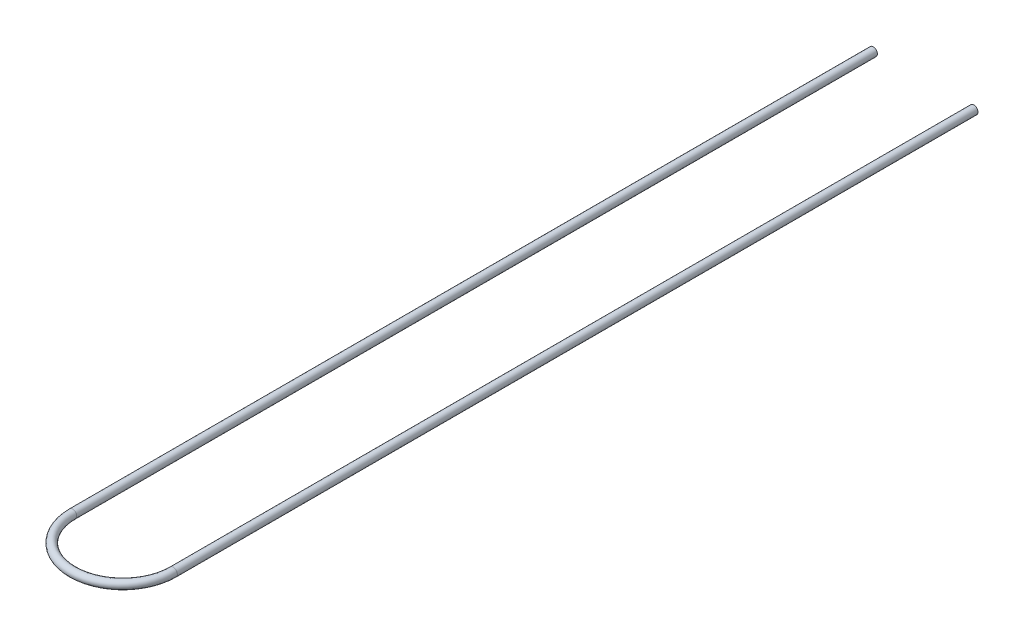
ISO-10303-21;
HEADER;
FILE_DESCRIPTION(('STEP AP214'),'2;1');
FILE_NAME('part.step','',(''),(''),'','','');
FILE_SCHEMA(('AUTOMOTIVE_DESIGN { 1 0 10303 214 1 1 1 1 }'));
ENDSEC;
DATA;
#1=APPLICATION_CONTEXT('core data for automotive mechanical design processes');
#2=APPLICATION_PROTOCOL_DEFINITION('international standard','automotive_design',2000,#1);
#3=PRODUCT_CONTEXT('',#1,'mechanical');
#4=PRODUCT('Part','Part','',(#3));
#5=PRODUCT_RELATED_PRODUCT_CATEGORY('part','',(#4));
#6=PRODUCT_DEFINITION_FORMATION('','',#4);
#7=PRODUCT_DEFINITION_CONTEXT('part definition',#1,'design');
#8=PRODUCT_DEFINITION('design','',#6,#7);
#9=PRODUCT_DEFINITION_SHAPE('','',#8);
#10=(LENGTH_UNIT() NAMED_UNIT(*) SI_UNIT(.MILLI.,.METRE.));
#11=(NAMED_UNIT(*) PLANE_ANGLE_UNIT() SI_UNIT($,.RADIAN.));
#12=(NAMED_UNIT(*) SI_UNIT($,.STERADIAN.) SOLID_ANGLE_UNIT());
#13=UNCERTAINTY_MEASURE_WITH_UNIT(LENGTH_MEASURE(1.E-05),#10,'distance_accuracy_value','');
#14=(GEOMETRIC_REPRESENTATION_CONTEXT(3) GLOBAL_UNCERTAINTY_ASSIGNED_CONTEXT((#13)) GLOBAL_UNIT_ASSIGNED_CONTEXT((#10,
#11,#12)) REPRESENTATION_CONTEXT('',''));
#15=CARTESIAN_POINT('',(0.,0.,0.));
#16=DIRECTION('',(0.,0.,1.));
#17=DIRECTION('',(1.,0.,0.));
#18=AXIS2_PLACEMENT_3D('',#15,#16,#17);
#19=CARTESIAN_POINT('',(-40.,0.,299.999999999999));
#20=DIRECTION('',(0.,0.,1.));
#21=DIRECTION('',(1.,0.,0.));
#22=AXIS2_PLACEMENT_3D('',#19,#20,#21);
#23=CYLINDRICAL_SURFACE('',#22,11.1);
#24=CARTESIAN_POINT('',(-39.9999999999997,0.,2440.));
#25=DIRECTION('',(0.,0.,1.));
#26=DIRECTION('',(1.,0.,0.));
#27=AXIS2_PLACEMENT_3D('',#24,#25,#26);
#28=CIRCLE('',#27,11.1);
#29=CARTESIAN_POINT('',(-51.0999999999997,0.,2440.));
#30=VERTEX_POINT('',#29);
#31=EDGE_CURVE('E52',#30,#30,#28,.T.);
#32=ORIENTED_EDGE('',*,*,#31,.F.);
#33=EDGE_LOOP('',(#32));
#34=FACE_BOUND('',#33,.T.);
#35=CARTESIAN_POINT('',(-40.,0.,299.999999999999));
#36=DIRECTION('',(0.,0.,1.));
#37=DIRECTION('',(1.,0.,0.));
#38=AXIS2_PLACEMENT_3D('',#35,#36,#37);
#39=CIRCLE('',#38,11.1);
#40=CARTESIAN_POINT('',(-28.9,0.,299.999999999999));
#41=VERTEX_POINT('',#40);
#42=EDGE_CURVE('E50',#41,#41,#39,.T.);
#43=ORIENTED_EDGE('',*,*,#42,.T.);
#44=EDGE_LOOP('',(#43));
#45=FACE_BOUND('',#44,.T.);
#46=ADVANCED_FACE('F29',(#34,#45),#23,.T.);
#47=CARTESIAN_POINT('',(94.4650000000003,0.,2440.));
#48=DIRECTION('',(0.,1.,0.));
#49=DIRECTION('',(0.,0.,1.));
#50=AXIS2_PLACEMENT_3D('',#47,#48,#49);
#51=TOROIDAL_SURFACE('',#50,134.465,11.1);
#52=CARTESIAN_POINT('',(228.93,0.,2440.));
#53=DIRECTION('',(0.,0.,-1.));
#54=DIRECTION('',(-1.,0.,0.));
#55=AXIS2_PLACEMENT_3D('',#52,#53,#54);
#56=CIRCLE('',#55,11.1);
#57=CARTESIAN_POINT('',(240.03,0.,2440.));
#58=VERTEX_POINT('',#57);
#59=EDGE_CURVE('E33',#58,#58,#56,.T.);
#60=CARTESIAN_POINT('',(94.4650000000003,0.,2440.));
#61=DIRECTION('',(0.,1.,0.));
#62=DIRECTION('',(0.,0.,1.));
#63=AXIS2_PLACEMENT_3D('',#60,#61,#62);
#64=CIRCLE('',#63,145.565);
#65=EDGE_CURVE('',#30,#58,#64,.T.);
#66=ORIENTED_EDGE('',*,*,#31,.T.);
#67=ORIENTED_EDGE('',*,*,#59,.F.);
#68=ORIENTED_EDGE('',*,*,#65,.T.);
#69=ORIENTED_EDGE('',*,*,#65,.F.);
#70=EDGE_LOOP('',(#66,#68,#67,#69));
#71=FACE_BOUND('',#70,.T.);
#72=ADVANCED_FACE('F60',(#71),#51,.T.);
#73=CARTESIAN_POINT('',(228.93,0.,2440.));
#74=DIRECTION('',(0.,0.,-1.));
#75=DIRECTION('',(-1.,0.,0.));
#76=AXIS2_PLACEMENT_3D('',#73,#74,#75);
#77=CYLINDRICAL_SURFACE('',#76,11.1);
#78=CARTESIAN_POINT('',(228.93,0.,299.999999999999));
#79=DIRECTION('',(0.,0.,-1.));
#80=DIRECTION('',(-1.,0.,0.));
#81=AXIS2_PLACEMENT_3D('',#78,#79,#80);
#82=CIRCLE('',#81,11.1);
#83=CARTESIAN_POINT('',(217.83,0.,299.999999999999));
#84=VERTEX_POINT('',#83);
#85=EDGE_CURVE('E46',#84,#84,#82,.T.);
#86=ORIENTED_EDGE('',*,*,#85,.F.);
#87=EDGE_LOOP('',(#86));
#88=FACE_BOUND('',#87,.T.);
#89=ORIENTED_EDGE('',*,*,#59,.T.);
#90=EDGE_LOOP('',(#89));
#91=FACE_BOUND('',#90,.T.);
#92=ADVANCED_FACE('F31',(#88,#91),#77,.T.);
#93=CARTESIAN_POINT('',(-40.,0.,299.999999999999));
#94=DIRECTION('',(0.,0.,1.));
#95=DIRECTION('',(1.,0.,0.));
#96=AXIS2_PLACEMENT_3D('',#93,#94,#95);
#97=PLANE('',#96);
#98=CARTESIAN_POINT('',(-40.,0.,299.999999999999));
#99=DIRECTION('',(0.,0.,1.));
#100=DIRECTION('',(1.,0.,0.));
#101=AXIS2_PLACEMENT_3D('',#98,#99,#100);
#102=CIRCLE('',#101,9.94999999999998);
#103=CARTESIAN_POINT('',(-30.05,0.,299.999999999999));
#104=VERTEX_POINT('',#103);
#105=EDGE_CURVE('E49',#104,#104,#102,.F.);
#106=ORIENTED_EDGE('',*,*,#105,.F.);
#107=EDGE_LOOP('',(#106));
#108=FACE_BOUND('',#107,.T.);
#109=ORIENTED_EDGE('',*,*,#42,.F.);
#110=EDGE_LOOP('',(#109));
#111=FACE_BOUND('',#110,.T.);
#112=ADVANCED_FACE('F66',(#108,#111),#97,.F.);
#113=CARTESIAN_POINT('',(228.93,0.,299.999999999999));
#114=DIRECTION('',(0.,0.,-1.));
#115=DIRECTION('',(-1.,0.,0.));
#116=AXIS2_PLACEMENT_3D('',#113,#114,#115);
#117=PLANE('',#116);
#118=CARTESIAN_POINT('',(228.93,0.,299.999999999999));
#119=DIRECTION('',(0.,0.,-1.));
#120=DIRECTION('',(-1.,0.,0.));
#121=AXIS2_PLACEMENT_3D('',#118,#119,#120);
#122=CIRCLE('',#121,9.94999999999998);
#123=CARTESIAN_POINT('',(218.98,0.,299.999999999999));
#124=VERTEX_POINT('',#123);
#125=EDGE_CURVE('E10',#124,#124,#122,.F.);
#126=ORIENTED_EDGE('',*,*,#125,.T.);
#127=EDGE_LOOP('',(#126));
#128=FACE_BOUND('',#127,.T.);
#129=ORIENTED_EDGE('',*,*,#85,.T.);
#130=EDGE_LOOP('',(#129));
#131=FACE_BOUND('',#130,.T.);
#132=ADVANCED_FACE('F84',(#128,#131),#117,.T.);
#133=CARTESIAN_POINT('',(-40.,0.,299.999999999999));
#134=DIRECTION('',(0.,0.,1.));
#135=DIRECTION('',(1.,0.,0.));
#136=AXIS2_PLACEMENT_3D('',#133,#134,#135);
#137=CYLINDRICAL_SURFACE('',#136,9.94999999999998);
#138=CARTESIAN_POINT('',(-39.9999999999997,0.,2440.));
#139=DIRECTION('',(0.,0.,1.));
#140=DIRECTION('',(1.,0.,0.));
#141=AXIS2_PLACEMENT_3D('',#138,#139,#140);
#142=CIRCLE('',#141,9.94999999999998);
#143=CARTESIAN_POINT('',(-49.9499999999997,0.,2440.));
#144=VERTEX_POINT('',#143);
#145=EDGE_CURVE('E42',#144,#144,#142,.F.);
#146=ORIENTED_EDGE('',*,*,#145,.F.);
#147=EDGE_LOOP('',(#146));
#148=FACE_BOUND('',#147,.T.);
#149=ORIENTED_EDGE('',*,*,#105,.T.);
#150=EDGE_LOOP('',(#149));
#151=FACE_BOUND('',#150,.T.);
#152=ADVANCED_FACE('F78',(#148,#151),#137,.F.);
#153=CARTESIAN_POINT('',(94.4650000000003,0.,2440.));
#154=DIRECTION('',(0.,1.,0.));
#155=DIRECTION('',(0.,0.,1.));
#156=AXIS2_PLACEMENT_3D('',#153,#154,#155);
#157=TOROIDAL_SURFACE('',#156,134.465,9.94999999999998);
#158=CARTESIAN_POINT('',(228.93,0.,2440.));
#159=DIRECTION('',(0.,0.,-1.));
#160=DIRECTION('',(-1.,0.,0.));
#161=AXIS2_PLACEMENT_3D('',#158,#159,#160);
#162=CIRCLE('',#161,9.94999999999998);
#163=CARTESIAN_POINT('',(238.88,0.,2440.));
#164=VERTEX_POINT('',#163);
#165=EDGE_CURVE('E37',#164,#164,#162,.F.);
#166=CARTESIAN_POINT('',(94.4650000000003,0.,2440.));
#167=DIRECTION('',(0.,1.,0.));
#168=DIRECTION('',(0.,0.,1.));
#169=AXIS2_PLACEMENT_3D('',#166,#167,#168);
#170=CIRCLE('',#169,144.415);
#171=EDGE_CURVE('',#144,#164,#170,.T.);
#172=ORIENTED_EDGE('',*,*,#145,.T.);
#173=ORIENTED_EDGE('',*,*,#165,.F.);
#174=ORIENTED_EDGE('',*,*,#171,.T.);
#175=ORIENTED_EDGE('',*,*,#171,.F.);
#176=EDGE_LOOP('',(#172,#174,#173,#175));
#177=FACE_BOUND('',#176,.T.);
#178=ADVANCED_FACE('F72',(#177),#157,.F.);
#179=CARTESIAN_POINT('',(228.93,0.,2440.));
#180=DIRECTION('',(0.,0.,-1.));
#181=DIRECTION('',(-1.,0.,0.));
#182=AXIS2_PLACEMENT_3D('',#179,#180,#181);
#183=CYLINDRICAL_SURFACE('',#182,9.94999999999998);
#184=ORIENTED_EDGE('',*,*,#125,.F.);
#185=EDGE_LOOP('',(#184));
#186=FACE_BOUND('',#185,.T.);
#187=ORIENTED_EDGE('',*,*,#165,.T.);
#188=EDGE_LOOP('',(#187));
#189=FACE_BOUND('',#188,.T.);
#190=ADVANCED_FACE('F70',(#186,#189),#183,.F.);
#191=CLOSED_SHELL('',(#46,#72,#92,#112,#132,#152,#178,#190));
#192=MANIFOLD_SOLID_BREP('B2',#191);
#193=ADVANCED_BREP_SHAPE_REPRESENTATION('',(#18,#192),#14);
#194=SHAPE_DEFINITION_REPRESENTATION(#9,#193);
ENDSEC;
END-ISO-10303-21;
